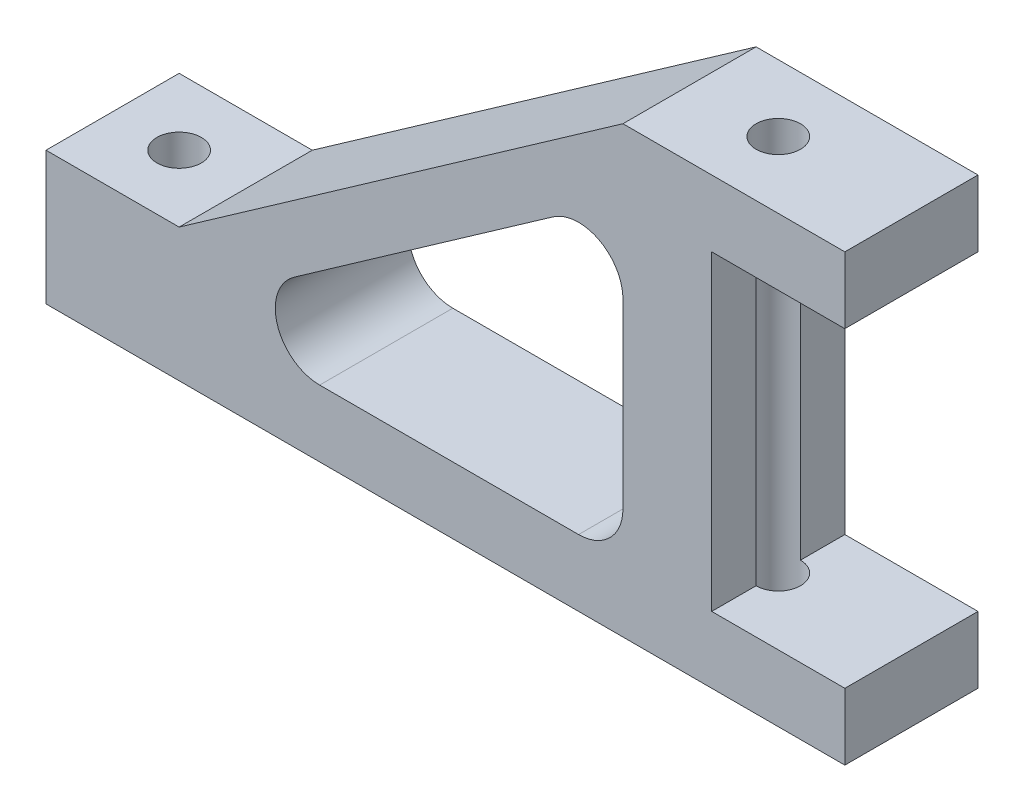
ISO-10303-21;
HEADER;
FILE_DESCRIPTION(('STEP AP214'),'2;1');
FILE_NAME('part.step','',(''),(''),'','','');
FILE_SCHEMA(('AUTOMOTIVE_DESIGN { 1 0 10303 214 1 1 1 1 }'));
ENDSEC;
DATA;
#1=APPLICATION_CONTEXT('core data for automotive mechanical design processes');
#2=APPLICATION_PROTOCOL_DEFINITION('international standard','automotive_design',2000,#1);
#3=PRODUCT_CONTEXT('',#1,'mechanical');
#4=PRODUCT('Part','Part','',(#3));
#5=PRODUCT_RELATED_PRODUCT_CATEGORY('part','',(#4));
#6=PRODUCT_DEFINITION_FORMATION('','',#4);
#7=PRODUCT_DEFINITION_CONTEXT('part definition',#1,'design');
#8=PRODUCT_DEFINITION('design','',#6,#7);
#9=PRODUCT_DEFINITION_SHAPE('','',#8);
#10=(LENGTH_UNIT() NAMED_UNIT(*) SI_UNIT(.MILLI.,.METRE.));
#11=(NAMED_UNIT(*) PLANE_ANGLE_UNIT() SI_UNIT($,.RADIAN.));
#12=(NAMED_UNIT(*) SI_UNIT($,.STERADIAN.) SOLID_ANGLE_UNIT());
#13=UNCERTAINTY_MEASURE_WITH_UNIT(LENGTH_MEASURE(1.E-05),#10,'distance_accuracy_value','');
#14=(GEOMETRIC_REPRESENTATION_CONTEXT(3) GLOBAL_UNCERTAINTY_ASSIGNED_CONTEXT((#13)) GLOBAL_UNIT_ASSIGNED_CONTEXT((#10,
#11,#12)) REPRESENTATION_CONTEXT('',''));
#15=CARTESIAN_POINT('',(0.,0.,0.));
#16=DIRECTION('',(0.,0.,1.));
#17=DIRECTION('',(1.,0.,0.));
#18=AXIS2_PLACEMENT_3D('',#15,#16,#17);
#19=CARTESIAN_POINT('',(72.4968152866244,0.,30.));
#20=DIRECTION('',(-1.,0.,0.));
#21=DIRECTION('',(0.,0.,1.));
#22=AXIS2_PLACEMENT_3D('',#19,#20,#21);
#23=PLANE('',#22);
#24=DIRECTION('',(0.,0.,-1.));
#25=VECTOR('',#24,1.);
#26=CARTESIAN_POINT('',(72.4968152866244,0.,30.));
#27=LINE('',#26,#25);
#28=CARTESIAN_POINT('',(72.4968152866244,0.,30.));
#29=VERTEX_POINT('',#28);
#30=CARTESIAN_POINT('',(72.4968152866244,0.,20.));
#31=VERTEX_POINT('',#30);
#32=EDGE_CURVE('E180',#29,#31,#27,.T.);
#33=ORIENTED_EDGE('',*,*,#32,.T.);
#34=DIRECTION('',(0.,1.,0.));
#35=VECTOR('',#34,1.);
#36=CARTESIAN_POINT('',(72.4968152866244,-75.,20.));
#37=LINE('',#36,#35);
#38=CARTESIAN_POINT('',(72.4968152866244,70.1656050955414,20.));
#39=VERTEX_POINT('',#38);
#40=EDGE_CURVE('E166',#31,#39,#37,.T.);
#41=ORIENTED_EDGE('',*,*,#40,.T.);
#42=DIRECTION('',(0.,0.,-1.));
#43=VECTOR('',#42,1.);
#44=CARTESIAN_POINT('',(72.4968152866244,70.1656050955414,30.));
#45=LINE('',#44,#43);
#46=CARTESIAN_POINT('',(72.4968152866244,70.1656050955414,30.));
#47=VERTEX_POINT('',#46);
#48=EDGE_CURVE('E177',#47,#39,#45,.T.);
#49=ORIENTED_EDGE('',*,*,#48,.F.);
#50=DIRECTION('',(0.,1.,0.));
#51=VECTOR('',#50,1.);
#52=CARTESIAN_POINT('',(72.4968152866244,0.,30.));
#53=LINE('',#52,#51);
#54=EDGE_CURVE('E278',#29,#47,#53,.T.);
#55=ORIENTED_EDGE('',*,*,#54,.F.);
#56=EDGE_LOOP('',(#33,#41,#49,#55));
#57=FACE_BOUND('',#56,.T.);
#58=ADVANCED_FACE('F38',(#57),#23,.F.);
#59=CARTESIAN_POINT('',(0.,0.,30.));
#60=DIRECTION('',(0.,0.,1.));
#61=DIRECTION('',(1.,0.,0.));
#62=AXIS2_PLACEMENT_3D('',#59,#60,#61);
#63=PLANE('',#62);
#64=DIRECTION('',(-1.,0.,0.));
#65=VECTOR('',#64,1.);
#66=CARTESIAN_POINT('',(-77.5031847133759,15.,30.));
#67=LINE('',#66,#65);
#68=CARTESIAN_POINT('',(-47.5031847133759,15.,30.));
#69=VERTEX_POINT('',#68);
#70=CARTESIAN_POINT('',(-77.5031847133759,15.,30.));
#71=VERTEX_POINT('',#70);
#72=EDGE_CURVE('E266',#69,#71,#67,.T.);
#73=ORIENTED_EDGE('',*,*,#72,.T.);
#74=DIRECTION('',(0.,-1.,0.));
#75=VECTOR('',#74,1.);
#76=CARTESIAN_POINT('',(-77.5031847133759,15.,30.));
#77=LINE('',#76,#75);
#78=CARTESIAN_POINT('',(-77.5031847133756,-15.,30.));
#79=VERTEX_POINT('',#78);
#80=EDGE_CURVE('E269',#71,#79,#77,.T.);
#81=ORIENTED_EDGE('',*,*,#80,.T.);
#82=DIRECTION('',(1.,0.,0.));
#83=VECTOR('',#82,1.);
#84=CARTESIAN_POINT('',(-77.5031847133756,-15.,30.));
#85=LINE('',#84,#83);
#86=CARTESIAN_POINT('',(102.496815286624,-15.,30.));
#87=VERTEX_POINT('',#86);
#88=EDGE_CURVE('E272',#79,#87,#85,.T.);
#89=ORIENTED_EDGE('',*,*,#88,.T.);
#90=DIRECTION('',(0.,1.,0.));
#91=VECTOR('',#90,1.);
#92=CARTESIAN_POINT('',(102.496815286624,-15.,30.));
#93=LINE('',#92,#91);
#94=CARTESIAN_POINT('',(102.496815286624,0.,30.));
#95=VERTEX_POINT('',#94);
#96=EDGE_CURVE('E274',#87,#95,#93,.T.);
#97=ORIENTED_EDGE('',*,*,#96,.T.);
#98=DIRECTION('',(-1.,0.,0.));
#99=VECTOR('',#98,1.);
#100=CARTESIAN_POINT('',(102.496815286624,0.,30.));
#101=LINE('',#100,#99);
#102=EDGE_CURVE('E276',#95,#29,#101,.T.);
#103=ORIENTED_EDGE('',*,*,#102,.T.);
#104=ORIENTED_EDGE('',*,*,#54,.T.);
#105=DIRECTION('',(1.,0.,0.));
#106=VECTOR('',#105,1.);
#107=CARTESIAN_POINT('',(72.4968152866244,70.1656050955414,30.));
#108=LINE('',#107,#106);
#109=CARTESIAN_POINT('',(102.496815286624,70.1656050955414,30.));
#110=VERTEX_POINT('',#109);
#111=EDGE_CURVE('E185',#47,#110,#108,.T.);
#112=ORIENTED_EDGE('',*,*,#111,.T.);
#113=DIRECTION('',(0.,1.,0.));
#114=VECTOR('',#113,1.);
#115=CARTESIAN_POINT('',(102.496815286624,70.1656050955414,30.));
#116=LINE('',#115,#114);
#117=CARTESIAN_POINT('',(102.496815286624,85.1656050955414,30.));
#118=VERTEX_POINT('',#117);
#119=EDGE_CURVE('E281',#110,#118,#116,.T.);
#120=ORIENTED_EDGE('',*,*,#119,.T.);
#121=DIRECTION('',(-1.,0.,0.));
#122=VECTOR('',#121,1.);
#123=CARTESIAN_POINT('',(102.496815286624,85.1656050955414,30.));
#124=LINE('',#123,#122);
#125=CARTESIAN_POINT('',(52.4968152866244,85.1656050955414,30.));
#126=VERTEX_POINT('',#125);
#127=EDGE_CURVE('E283',#118,#126,#124,.T.);
#128=ORIENTED_EDGE('',*,*,#127,.T.);
#129=DIRECTION('',(-0.818594540143988,-0.574371812371092,0.));
#130=VECTOR('',#129,1.);
#131=CARTESIAN_POINT('',(-47.5031847133759,15.,30.));
#132=LINE('',#131,#130);
#133=EDGE_CURVE('E285',#126,#69,#132,.T.);
#134=ORIENTED_EDGE('',*,*,#133,.T.);
#135=EDGE_LOOP('',(#73,#81,#89,#97,#103,#104,#112,#120,#128,#134));
#136=FACE_BOUND('',#135,.T.);
#137=DIRECTION('',(0.,1.,0.));
#138=VECTOR('',#137,1.);
#139=CARTESIAN_POINT('',(52.4968152866244,50.9329846080632,30.));
#140=LINE('',#139,#138);
#141=CARTESIAN_POINT('',(52.4968152866244,10.0000000000001,30.));
#142=VERTEX_POINT('',#141);
#143=CARTESIAN_POINT('',(52.4968152866244,50.9329846080632,30.));
#144=VERTEX_POINT('',#143);
#145=EDGE_CURVE('E225',#142,#144,#140,.T.);
#146=ORIENTED_EDGE('',*,*,#145,.F.);
#147=CARTESIAN_POINT('',(42.4968152866244,9.99999999999999,30.));
#148=DIRECTION('',(0.,0.,1.));
#149=DIRECTION('',(-1.,0.,0.));
#150=AXIS2_PLACEMENT_3D('',#147,#148,#149);
#151=CIRCLE('',#150,10.);
#152=CARTESIAN_POINT('',(42.4968152866243,0.,30.));
#153=VERTEX_POINT('',#152);
#154=EDGE_CURVE('E223',#153,#142,#151,.T.);
#155=ORIENTED_EDGE('',*,*,#154,.F.);
#156=DIRECTION('',(1.,0.,0.));
#157=VECTOR('',#156,1.);
#158=CARTESIAN_POINT('',(42.4968152866243,0.,30.));
#159=LINE('',#158,#157);
#160=CARTESIAN_POINT('',(-15.8408624863052,0.,30.));
#161=VERTEX_POINT('',#160);
#162=EDGE_CURVE('E234',#161,#153,#159,.T.);
#163=ORIENTED_EDGE('',*,*,#162,.F.);
#164=CARTESIAN_POINT('',(-15.8408624863056,10.,30.));
#165=DIRECTION('',(0.,0.,1.));
#166=DIRECTION('',(-1.,0.,0.));
#167=AXIS2_PLACEMENT_3D('',#164,#165,#166);
#168=CIRCLE('',#167,10.);
#169=CARTESIAN_POINT('',(-21.5845806100162,18.1859454014401,30.));
#170=VERTEX_POINT('',#169);
#171=EDGE_CURVE('E232',#170,#161,#168,.T.);
#172=ORIENTED_EDGE('',*,*,#171,.F.);
#173=DIRECTION('',(-0.818594540143988,-0.574371812371092,0.));
#174=VECTOR('',#173,1.);
#175=CARTESIAN_POINT('',(-21.5845806100162,18.1859454014401,30.));
#176=LINE('',#175,#174);
#177=CARTESIAN_POINT('',(36.7530971629133,59.1189300095032,30.));
#178=VERTEX_POINT('',#177);
#179=EDGE_CURVE('E230',#178,#170,#176,.T.);
#180=ORIENTED_EDGE('',*,*,#179,.F.);
#181=CARTESIAN_POINT('',(42.4968152866244,50.9329846080634,30.));
#182=DIRECTION('',(0.,0.,1.));
#183=DIRECTION('',(1.,0.,0.));
#184=AXIS2_PLACEMENT_3D('',#181,#182,#183);
#185=CIRCLE('',#184,10.);
#186=EDGE_CURVE('E228',#144,#178,#185,.T.);
#187=ORIENTED_EDGE('',*,*,#186,.F.);
#188=EDGE_LOOP('',(#146,#155,#163,#172,#180,#187));
#189=FACE_BOUND('',#188,.T.);
#190=ADVANCED_FACE('F337',(#136,#189),#63,.T.);
#191=CARTESIAN_POINT('',(0.,0.,0.));
#192=DIRECTION('',(0.,0.,1.));
#193=DIRECTION('',(1.,0.,0.));
#194=AXIS2_PLACEMENT_3D('',#191,#192,#193);
#195=PLANE('',#194);
#196=DIRECTION('',(-1.,0.,0.));
#197=VECTOR('',#196,1.);
#198=CARTESIAN_POINT('',(-77.5031847133759,15.,0.));
#199=LINE('',#198,#197);
#200=CARTESIAN_POINT('',(-47.5031847133759,15.,0.));
#201=VERTEX_POINT('',#200);
#202=CARTESIAN_POINT('',(-77.5031847133759,15.,0.));
#203=VERTEX_POINT('',#202);
#204=EDGE_CURVE('E265',#201,#203,#199,.T.);
#205=ORIENTED_EDGE('',*,*,#204,.F.);
#206=DIRECTION('',(-0.818594540143988,-0.574371812371092,0.));
#207=VECTOR('',#206,1.);
#208=CARTESIAN_POINT('',(-47.5031847133759,15.,0.));
#209=LINE('',#208,#207);
#210=CARTESIAN_POINT('',(52.4968152866244,85.1656050955414,0.));
#211=VERTEX_POINT('',#210);
#212=EDGE_CURVE('E270',#211,#201,#209,.T.);
#213=ORIENTED_EDGE('',*,*,#212,.F.);
#214=DIRECTION('',(-1.,0.,0.));
#215=VECTOR('',#214,1.);
#216=CARTESIAN_POINT('',(102.496815286624,85.1656050955414,0.));
#217=LINE('',#216,#215);
#218=CARTESIAN_POINT('',(102.496815286624,85.1656050955414,0.));
#219=VERTEX_POINT('',#218);
#220=EDGE_CURVE('E306',#219,#211,#217,.T.);
#221=ORIENTED_EDGE('',*,*,#220,.F.);
#222=DIRECTION('',(0.,1.,0.));
#223=VECTOR('',#222,1.);
#224=CARTESIAN_POINT('',(102.496815286624,70.1656050955414,0.));
#225=LINE('',#224,#223);
#226=CARTESIAN_POINT('',(102.496815286624,70.1656050955414,0.));
#227=VERTEX_POINT('',#226);
#228=EDGE_CURVE('E304',#227,#219,#225,.T.);
#229=ORIENTED_EDGE('',*,*,#228,.F.);
#230=DIRECTION('',(1.,0.,0.));
#231=VECTOR('',#230,1.);
#232=CARTESIAN_POINT('',(72.4968152866244,70.1656050955414,0.));
#233=LINE('',#232,#231);
#234=CARTESIAN_POINT('',(72.4968152866244,70.1656050955414,0.));
#235=VERTEX_POINT('',#234);
#236=EDGE_CURVE('E302',#235,#227,#233,.T.);
#237=ORIENTED_EDGE('',*,*,#236,.F.);
#238=DIRECTION('',(0.,1.,0.));
#239=VECTOR('',#238,1.);
#240=CARTESIAN_POINT('',(72.4968152866244,0.,0.));
#241=LINE('',#240,#239);
#242=CARTESIAN_POINT('',(72.4968152866244,0.,0.));
#243=VERTEX_POINT('',#242);
#244=EDGE_CURVE('E299',#243,#235,#241,.T.);
#245=ORIENTED_EDGE('',*,*,#244,.F.);
#246=DIRECTION('',(-1.,0.,0.));
#247=VECTOR('',#246,1.);
#248=CARTESIAN_POINT('',(102.496815286624,0.,0.));
#249=LINE('',#248,#247);
#250=CARTESIAN_POINT('',(102.496815286624,0.,0.));
#251=VERTEX_POINT('',#250);
#252=EDGE_CURVE('E296',#251,#243,#249,.T.);
#253=ORIENTED_EDGE('',*,*,#252,.F.);
#254=DIRECTION('',(0.,1.,0.));
#255=VECTOR('',#254,1.);
#256=CARTESIAN_POINT('',(102.496815286624,-15.,0.));
#257=LINE('',#256,#255);
#258=CARTESIAN_POINT('',(102.496815286624,-15.,0.));
#259=VERTEX_POINT('',#258);
#260=EDGE_CURVE('E294',#259,#251,#257,.T.);
#261=ORIENTED_EDGE('',*,*,#260,.F.);
#262=DIRECTION('',(1.,0.,0.));
#263=VECTOR('',#262,1.);
#264=CARTESIAN_POINT('',(-77.5031847133756,-15.,0.));
#265=LINE('',#264,#263);
#266=CARTESIAN_POINT('',(-77.5031847133756,-15.,0.));
#267=VERTEX_POINT('',#266);
#268=EDGE_CURVE('E292',#267,#259,#265,.T.);
#269=ORIENTED_EDGE('',*,*,#268,.F.);
#270=DIRECTION('',(0.,-1.,0.));
#271=VECTOR('',#270,1.);
#272=CARTESIAN_POINT('',(-77.5031847133759,15.,0.));
#273=LINE('',#272,#271);
#274=EDGE_CURVE('E290',#203,#267,#273,.T.);
#275=ORIENTED_EDGE('',*,*,#274,.F.);
#276=EDGE_LOOP('',(#205,#213,#221,#229,#237,#245,#253,#261,#269,#275));
#277=FACE_BOUND('',#276,.T.);
#278=CARTESIAN_POINT('',(42.4968152866244,9.99999999999999,0.));
#279=DIRECTION('',(0.,0.,1.));
#280=DIRECTION('',(-1.,0.,0.));
#281=AXIS2_PLACEMENT_3D('',#278,#279,#280);
#282=CIRCLE('',#281,10.);
#283=CARTESIAN_POINT('',(42.4968152866243,0.,0.));
#284=VERTEX_POINT('',#283);
#285=CARTESIAN_POINT('',(52.4968152866244,10.0000000000001,0.));
#286=VERTEX_POINT('',#285);
#287=EDGE_CURVE('E222',#284,#286,#282,.T.);
#288=ORIENTED_EDGE('',*,*,#287,.T.);
#289=DIRECTION('',(0.,1.,0.));
#290=VECTOR('',#289,1.);
#291=CARTESIAN_POINT('',(52.4968152866244,50.9329846080632,0.));
#292=LINE('',#291,#290);
#293=CARTESIAN_POINT('',(52.4968152866244,50.9329846080632,0.));
#294=VERTEX_POINT('',#293);
#295=EDGE_CURVE('E239',#286,#294,#292,.T.);
#296=ORIENTED_EDGE('',*,*,#295,.T.);
#297=CARTESIAN_POINT('',(42.4968152866244,50.9329846080634,0.));
#298=DIRECTION('',(0.,0.,1.));
#299=DIRECTION('',(1.,0.,0.));
#300=AXIS2_PLACEMENT_3D('',#297,#298,#299);
#301=CIRCLE('',#300,10.);
#302=CARTESIAN_POINT('',(36.7530971629133,59.1189300095032,0.));
#303=VERTEX_POINT('',#302);
#304=EDGE_CURVE('E242',#294,#303,#301,.T.);
#305=ORIENTED_EDGE('',*,*,#304,.T.);
#306=DIRECTION('',(-0.818594540143988,-0.574371812371092,0.));
#307=VECTOR('',#306,1.);
#308=CARTESIAN_POINT('',(-21.5845806100162,18.1859454014401,0.));
#309=LINE('',#308,#307);
#310=CARTESIAN_POINT('',(-21.5845806100162,18.1859454014401,0.));
#311=VERTEX_POINT('',#310);
#312=EDGE_CURVE('E245',#303,#311,#309,.T.);
#313=ORIENTED_EDGE('',*,*,#312,.T.);
#314=CARTESIAN_POINT('',(-15.8408624863056,10.,0.));
#315=DIRECTION('',(0.,0.,1.));
#316=DIRECTION('',(-1.,0.,0.));
#317=AXIS2_PLACEMENT_3D('',#314,#315,#316);
#318=CIRCLE('',#317,10.);
#319=CARTESIAN_POINT('',(-15.8408624863052,0.,0.));
#320=VERTEX_POINT('',#319);
#321=EDGE_CURVE('E248',#311,#320,#318,.T.);
#322=ORIENTED_EDGE('',*,*,#321,.T.);
#323=DIRECTION('',(1.,0.,0.));
#324=VECTOR('',#323,1.);
#325=CARTESIAN_POINT('',(42.4968152866243,0.,0.));
#326=LINE('',#325,#324);
#327=EDGE_CURVE('E226',#320,#284,#326,.T.);
#328=ORIENTED_EDGE('',*,*,#327,.T.);
#329=EDGE_LOOP('',(#288,#296,#305,#313,#322,#328));
#330=FACE_BOUND('',#329,.T.);
#331=ADVANCED_FACE('F326',(#277,#330),#195,.F.);
#332=CARTESIAN_POINT('',(-77.5031847133759,15.,30.));
#333=DIRECTION('',(0.,-1.,0.));
#334=DIRECTION('',(0.,0.,-1.));
#335=AXIS2_PLACEMENT_3D('',#332,#333,#334);
#336=PLANE('',#335);
#337=CARTESIAN_POINT('',(-62.5031847133759,15.,15.));
#338=DIRECTION('',(0.,-1.,0.));
#339=DIRECTION('',(0.,0.,-1.));
#340=AXIS2_PLACEMENT_3D('',#337,#338,#339);
#341=CIRCLE('',#340,5.);
#342=CARTESIAN_POINT('',(-62.5031847133759,15.,10.));
#343=VERTEX_POINT('',#342);
#344=EDGE_CURVE('E217',#343,#343,#341,.T.);
#345=ORIENTED_EDGE('',*,*,#344,.T.);
#346=EDGE_LOOP('',(#345));
#347=FACE_BOUND('',#346,.T.);
#348=ORIENTED_EDGE('',*,*,#204,.T.);
#349=DIRECTION('',(0.,0.,-1.));
#350=VECTOR('',#349,1.);
#351=CARTESIAN_POINT('',(-77.5031847133759,15.,30.));
#352=LINE('',#351,#350);
#353=EDGE_CURVE('E11',#71,#203,#352,.T.);
#354=ORIENTED_EDGE('',*,*,#353,.F.);
#355=ORIENTED_EDGE('',*,*,#72,.F.);
#356=DIRECTION('',(0.,0.,-1.));
#357=VECTOR('',#356,1.);
#358=CARTESIAN_POINT('',(-47.5031847133759,15.,30.));
#359=LINE('',#358,#357);
#360=EDGE_CURVE('E287',#69,#201,#359,.T.);
#361=ORIENTED_EDGE('',*,*,#360,.T.);
#362=EDGE_LOOP('',(#348,#354,#355,#361));
#363=FACE_BOUND('',#362,.T.);
#364=ADVANCED_FACE('F40',(#347,#363),#336,.F.);
#365=CARTESIAN_POINT('',(-77.5031847133759,15.,30.));
#366=DIRECTION('',(1.,0.,0.));
#367=DIRECTION('',(0.,1.,0.));
#368=AXIS2_PLACEMENT_3D('',#365,#366,#367);
#369=PLANE('',#368);
#370=ORIENTED_EDGE('',*,*,#274,.T.);
#371=DIRECTION('',(0.,0.,-1.));
#372=VECTOR('',#371,1.);
#373=CARTESIAN_POINT('',(-77.5031847133756,-15.,30.));
#374=LINE('',#373,#372);
#375=EDGE_CURVE('E47',#79,#267,#374,.T.);
#376=ORIENTED_EDGE('',*,*,#375,.F.);
#377=ORIENTED_EDGE('',*,*,#80,.F.);
#378=ORIENTED_EDGE('',*,*,#353,.T.);
#379=EDGE_LOOP('',(#370,#376,#377,#378));
#380=FACE_BOUND('',#379,.T.);
#381=ADVANCED_FACE('F360',(#380),#369,.F.);
#382=CARTESIAN_POINT('',(-77.5031847133756,-15.,30.));
#383=DIRECTION('',(0.,1.,0.));
#384=DIRECTION('',(0.,0.,1.));
#385=AXIS2_PLACEMENT_3D('',#382,#383,#384);
#386=PLANE('',#385);
#387=CARTESIAN_POINT('',(-62.5031847133759,-15.,15.));
#388=DIRECTION('',(0.,1.,0.));
#389=DIRECTION('',(0.,0.,1.));
#390=AXIS2_PLACEMENT_3D('',#387,#388,#389);
#391=CIRCLE('',#390,5.);
#392=CARTESIAN_POINT('',(-62.5031847133759,-15.,20.));
#393=VERTEX_POINT('',#392);
#394=EDGE_CURVE('E42',#393,#393,#391,.T.);
#395=ORIENTED_EDGE('',*,*,#394,.T.);
#396=EDGE_LOOP('',(#395));
#397=FACE_BOUND('',#396,.T.);
#398=CARTESIAN_POINT('',(72.4968152866241,-15.,15.));
#399=DIRECTION('',(0.,1.,0.));
#400=DIRECTION('',(0.,0.,1.));
#401=AXIS2_PLACEMENT_3D('',#398,#399,#400);
#402=CIRCLE('',#401,5.);
#403=CARTESIAN_POINT('',(72.4968152866241,-15.,20.));
#404=VERTEX_POINT('',#403);
#405=EDGE_CURVE('E213',#404,#404,#402,.T.);
#406=ORIENTED_EDGE('',*,*,#405,.T.);
#407=EDGE_LOOP('',(#406));
#408=FACE_BOUND('',#407,.T.);
#409=ORIENTED_EDGE('',*,*,#268,.T.);
#410=DIRECTION('',(0.,0.,-1.));
#411=VECTOR('',#410,1.);
#412=CARTESIAN_POINT('',(102.496815286624,-15.,30.));
#413=LINE('',#412,#411);
#414=EDGE_CURVE('E197',#87,#259,#413,.T.);
#415=ORIENTED_EDGE('',*,*,#414,.F.);
#416=ORIENTED_EDGE('',*,*,#88,.F.);
#417=ORIENTED_EDGE('',*,*,#375,.T.);
#418=EDGE_LOOP('',(#409,#415,#416,#417));
#419=FACE_BOUND('',#418,.T.);
#420=ADVANCED_FACE('F357',(#397,#408,#419),#386,.F.);
#421=CARTESIAN_POINT('',(102.496815286624,-15.,30.));
#422=DIRECTION('',(-1.,0.,0.));
#423=DIRECTION('',(0.,-1.,0.));
#424=AXIS2_PLACEMENT_3D('',#421,#422,#423);
#425=PLANE('',#424);
#426=ORIENTED_EDGE('',*,*,#260,.T.);
#427=DIRECTION('',(0.,0.,-1.));
#428=VECTOR('',#427,1.);
#429=CARTESIAN_POINT('',(102.496815286624,0.,30.));
#430=LINE('',#429,#428);
#431=EDGE_CURVE('E194',#95,#251,#430,.T.);
#432=ORIENTED_EDGE('',*,*,#431,.F.);
#433=ORIENTED_EDGE('',*,*,#96,.F.);
#434=ORIENTED_EDGE('',*,*,#414,.T.);
#435=EDGE_LOOP('',(#426,#432,#433,#434));
#436=FACE_BOUND('',#435,.T.);
#437=ADVANCED_FACE('F353',(#436),#425,.F.);
#438=CARTESIAN_POINT('',(102.496815286624,0.,30.));
#439=DIRECTION('',(0.,-1.,0.));
#440=DIRECTION('',(1.,0.,0.));
#441=AXIS2_PLACEMENT_3D('',#438,#439,#440);
#442=PLANE('',#441);
#443=CARTESIAN_POINT('',(72.4968152866244,0.,9.99999999999999));
#444=VERTEX_POINT('',#443);
#445=EDGE_CURVE('E186',#444,#243,#27,.T.);
#446=ORIENTED_EDGE('',*,*,#445,.F.);
#447=CARTESIAN_POINT('',(72.4968152866241,0.,15.));
#448=DIRECTION('',(0.,-1.,0.));
#449=DIRECTION('',(1.,0.,0.));
#450=AXIS2_PLACEMENT_3D('',#447,#448,#449);
#451=CIRCLE('',#450,5.);
#452=EDGE_CURVE('E181',#444,#31,#451,.T.);
#453=ORIENTED_EDGE('',*,*,#452,.T.);
#454=ORIENTED_EDGE('',*,*,#32,.F.);
#455=ORIENTED_EDGE('',*,*,#102,.F.);
#456=ORIENTED_EDGE('',*,*,#431,.T.);
#457=ORIENTED_EDGE('',*,*,#252,.T.);
#458=EDGE_LOOP('',(#446,#453,#454,#455,#456,#457));
#459=FACE_BOUND('',#458,.T.);
#460=ADVANCED_FACE('F345',(#459),#442,.F.);
#461=CARTESIAN_POINT('',(72.4968152866244,70.1656050955414,9.99999999999999));
#462=VERTEX_POINT('',#461);
#463=EDGE_CURVE('E187',#462,#235,#45,.T.);
#464=ORIENTED_EDGE('',*,*,#463,.F.);
#465=DIRECTION('',(0.,1.,0.));
#466=VECTOR('',#465,1.);
#467=CARTESIAN_POINT('',(72.4968152866244,-75.,9.99999999999999));
#468=LINE('',#467,#466);
#469=EDGE_CURVE('E55',#462,#444,#468,.F.);
#470=ORIENTED_EDGE('',*,*,#469,.T.);
#471=ORIENTED_EDGE('',*,*,#445,.T.);
#472=ORIENTED_EDGE('',*,*,#244,.T.);
#473=EDGE_LOOP('',(#464,#470,#471,#472));
#474=FACE_BOUND('',#473,.T.);
#475=ADVANCED_FACE('F347',(#474),#23,.F.);
#476=CARTESIAN_POINT('',(72.4968152866244,70.1656050955414,30.));
#477=DIRECTION('',(0.,1.,0.));
#478=DIRECTION('',(0.,0.,1.));
#479=AXIS2_PLACEMENT_3D('',#476,#477,#478);
#480=PLANE('',#479);
#481=ORIENTED_EDGE('',*,*,#48,.T.);
#482=CARTESIAN_POINT('',(72.4968152866241,70.1656050955414,15.));
#483=DIRECTION('',(0.,1.,0.));
#484=DIRECTION('',(0.,0.,1.));
#485=AXIS2_PLACEMENT_3D('',#482,#483,#484);
#486=CIRCLE('',#485,5.);
#487=EDGE_CURVE('E162',#39,#462,#486,.T.);
#488=ORIENTED_EDGE('',*,*,#487,.T.);
#489=ORIENTED_EDGE('',*,*,#463,.T.);
#490=ORIENTED_EDGE('',*,*,#236,.T.);
#491=DIRECTION('',(0.,0.,-1.));
#492=VECTOR('',#491,1.);
#493=CARTESIAN_POINT('',(102.496815286624,70.1656050955414,30.));
#494=LINE('',#493,#492);
#495=EDGE_CURVE('E190',#110,#227,#494,.T.);
#496=ORIENTED_EDGE('',*,*,#495,.F.);
#497=ORIENTED_EDGE('',*,*,#111,.F.);
#498=EDGE_LOOP('',(#481,#488,#489,#490,#496,#497));
#499=FACE_BOUND('',#498,.T.);
#500=ADVANCED_FACE('F183',(#499),#480,.F.);
#501=CARTESIAN_POINT('',(102.496815286624,70.1656050955414,30.));
#502=DIRECTION('',(-1.,0.,0.));
#503=DIRECTION('',(0.,-1.,0.));
#504=AXIS2_PLACEMENT_3D('',#501,#502,#503);
#505=PLANE('',#504);
#506=ORIENTED_EDGE('',*,*,#228,.T.);
#507=DIRECTION('',(0.,0.,-1.));
#508=VECTOR('',#507,1.);
#509=CARTESIAN_POINT('',(102.496815286624,85.1656050955414,30.));
#510=LINE('',#509,#508);
#511=EDGE_CURVE('E313',#118,#219,#510,.T.);
#512=ORIENTED_EDGE('',*,*,#511,.F.);
#513=ORIENTED_EDGE('',*,*,#119,.F.);
#514=ORIENTED_EDGE('',*,*,#495,.T.);
#515=EDGE_LOOP('',(#506,#512,#513,#514));
#516=FACE_BOUND('',#515,.T.);
#517=ADVANCED_FACE('F322',(#516),#505,.F.);
#518=CARTESIAN_POINT('',(102.496815286624,85.1656050955414,30.));
#519=DIRECTION('',(0.,-1.,0.));
#520=DIRECTION('',(0.,0.,-1.));
#521=AXIS2_PLACEMENT_3D('',#518,#519,#520);
#522=PLANE('',#521);
#523=CARTESIAN_POINT('',(72.4968152866241,85.1656050955414,15.));
#524=DIRECTION('',(0.,-1.,0.));
#525=DIRECTION('',(0.,0.,-1.));
#526=AXIS2_PLACEMENT_3D('',#523,#524,#525);
#527=CIRCLE('',#526,5.);
#528=CARTESIAN_POINT('',(72.4968152866241,85.1656050955414,9.99999999999999));
#529=VERTEX_POINT('',#528);
#530=EDGE_CURVE('E171',#529,#529,#527,.T.);
#531=ORIENTED_EDGE('',*,*,#530,.T.);
#532=EDGE_LOOP('',(#531));
#533=FACE_BOUND('',#532,.T.);
#534=ORIENTED_EDGE('',*,*,#220,.T.);
#535=DIRECTION('',(0.,0.,-1.));
#536=VECTOR('',#535,1.);
#537=CARTESIAN_POINT('',(52.4968152866244,85.1656050955414,30.));
#538=LINE('',#537,#536);
#539=EDGE_CURVE('E311',#126,#211,#538,.T.);
#540=ORIENTED_EDGE('',*,*,#539,.F.);
#541=ORIENTED_EDGE('',*,*,#127,.F.);
#542=ORIENTED_EDGE('',*,*,#511,.T.);
#543=EDGE_LOOP('',(#534,#540,#541,#542));
#544=FACE_BOUND('',#543,.T.);
#545=ADVANCED_FACE('F204',(#533,#544),#522,.F.);
#546=CARTESIAN_POINT('',(-47.5031847133759,15.,30.));
#547=DIRECTION('',(0.574371812371092,-0.818594540143988,0.));
#548=DIRECTION('',(0.818594540143988,0.574371812371092,0.));
#549=AXIS2_PLACEMENT_3D('',#546,#547,#548);
#550=PLANE('',#549);
#551=ORIENTED_EDGE('',*,*,#212,.T.);
#552=ORIENTED_EDGE('',*,*,#360,.F.);
#553=ORIENTED_EDGE('',*,*,#133,.F.);
#554=ORIENTED_EDGE('',*,*,#539,.T.);
#555=EDGE_LOOP('',(#551,#552,#553,#554));
#556=FACE_BOUND('',#555,.T.);
#557=ADVANCED_FACE('F333',(#556),#550,.F.);
#558=CARTESIAN_POINT('',(42.4968152866244,9.99999999999999,30.));
#559=DIRECTION('',(0.,0.,-1.));
#560=DIRECTION('',(-1.,0.,0.));
#561=AXIS2_PLACEMENT_3D('',#558,#559,#560);
#562=CYLINDRICAL_SURFACE('',#561,10.);
#563=ORIENTED_EDGE('',*,*,#287,.F.);
#564=DIRECTION('',(0.,0.,-1.));
#565=VECTOR('',#564,1.);
#566=CARTESIAN_POINT('',(42.4968152866243,0.,30.));
#567=LINE('',#566,#565);
#568=EDGE_CURVE('E236',#153,#284,#567,.T.);
#569=ORIENTED_EDGE('',*,*,#568,.F.);
#570=ORIENTED_EDGE('',*,*,#154,.T.);
#571=DIRECTION('',(0.,0.,-1.));
#572=VECTOR('',#571,1.);
#573=CARTESIAN_POINT('',(52.4968152866244,10.0000000000001,30.));
#574=LINE('',#573,#572);
#575=EDGE_CURVE('E262',#142,#286,#574,.T.);
#576=ORIENTED_EDGE('',*,*,#575,.T.);
#577=EDGE_LOOP('',(#563,#569,#570,#576));
#578=FACE_BOUND('',#577,.T.);
#579=ADVANCED_FACE('F417',(#578),#562,.F.);
#580=CARTESIAN_POINT('',(52.4968152866244,50.9329846080632,30.));
#581=DIRECTION('',(-1.,0.,0.));
#582=DIRECTION('',(0.,0.,1.));
#583=AXIS2_PLACEMENT_3D('',#580,#581,#582);
#584=PLANE('',#583);
#585=ORIENTED_EDGE('',*,*,#295,.F.);
#586=ORIENTED_EDGE('',*,*,#575,.F.);
#587=ORIENTED_EDGE('',*,*,#145,.T.);
#588=DIRECTION('',(0.,0.,-1.));
#589=VECTOR('',#588,1.);
#590=CARTESIAN_POINT('',(52.4968152866244,50.9329846080632,30.));
#591=LINE('',#590,#589);
#592=EDGE_CURVE('E260',#144,#294,#591,.T.);
#593=ORIENTED_EDGE('',*,*,#592,.T.);
#594=EDGE_LOOP('',(#585,#586,#587,#593));
#595=FACE_BOUND('',#594,.T.);
#596=ADVANCED_FACE('F413',(#595),#584,.T.);
#597=CARTESIAN_POINT('',(42.4968152866244,50.9329846080634,30.));
#598=DIRECTION('',(0.,0.,-1.));
#599=DIRECTION('',(-1.,0.,0.));
#600=AXIS2_PLACEMENT_3D('',#597,#598,#599);
#601=CYLINDRICAL_SURFACE('',#600,10.);
#602=ORIENTED_EDGE('',*,*,#304,.F.);
#603=ORIENTED_EDGE('',*,*,#592,.F.);
#604=ORIENTED_EDGE('',*,*,#186,.T.);
#605=DIRECTION('',(0.,0.,-1.));
#606=VECTOR('',#605,1.);
#607=CARTESIAN_POINT('',(36.7530971629133,59.1189300095032,30.));
#608=LINE('',#607,#606);
#609=EDGE_CURVE('E258',#178,#303,#608,.T.);
#610=ORIENTED_EDGE('',*,*,#609,.T.);
#611=EDGE_LOOP('',(#602,#603,#604,#610));
#612=FACE_BOUND('',#611,.T.);
#613=ADVANCED_FACE('F409',(#612),#601,.F.);
#614=CARTESIAN_POINT('',(-21.5845806100162,18.1859454014401,30.));
#615=DIRECTION('',(0.574371812371092,-0.818594540143988,0.));
#616=DIRECTION('',(0.818594540143988,0.574371812371092,0.));
#617=AXIS2_PLACEMENT_3D('',#614,#615,#616);
#618=PLANE('',#617);
#619=ORIENTED_EDGE('',*,*,#312,.F.);
#620=ORIENTED_EDGE('',*,*,#609,.F.);
#621=ORIENTED_EDGE('',*,*,#179,.T.);
#622=DIRECTION('',(0.,0.,-1.));
#623=VECTOR('',#622,1.);
#624=CARTESIAN_POINT('',(-21.5845806100162,18.1859454014401,30.));
#625=LINE('',#624,#623);
#626=EDGE_CURVE('E256',#170,#311,#625,.T.);
#627=ORIENTED_EDGE('',*,*,#626,.T.);
#628=EDGE_LOOP('',(#619,#620,#621,#627));
#629=FACE_BOUND('',#628,.T.);
#630=ADVANCED_FACE('F405',(#629),#618,.T.);
#631=CARTESIAN_POINT('',(-15.8408624863056,10.,30.));
#632=DIRECTION('',(0.,0.,-1.));
#633=DIRECTION('',(-1.,0.,0.));
#634=AXIS2_PLACEMENT_3D('',#631,#632,#633);
#635=CYLINDRICAL_SURFACE('',#634,10.);
#636=ORIENTED_EDGE('',*,*,#321,.F.);
#637=ORIENTED_EDGE('',*,*,#626,.F.);
#638=ORIENTED_EDGE('',*,*,#171,.T.);
#639=DIRECTION('',(0.,0.,-1.));
#640=VECTOR('',#639,1.);
#641=CARTESIAN_POINT('',(-15.8408624863052,0.,30.));
#642=LINE('',#641,#640);
#643=EDGE_CURVE('E63',#161,#320,#642,.T.);
#644=ORIENTED_EDGE('',*,*,#643,.T.);
#645=EDGE_LOOP('',(#636,#637,#638,#644));
#646=FACE_BOUND('',#645,.T.);
#647=ADVANCED_FACE('F402',(#646),#635,.F.);
#648=CARTESIAN_POINT('',(42.4968152866243,0.,30.));
#649=DIRECTION('',(0.,1.,0.));
#650=DIRECTION('',(-1.,0.,0.));
#651=AXIS2_PLACEMENT_3D('',#648,#649,#650);
#652=PLANE('',#651);
#653=ORIENTED_EDGE('',*,*,#327,.F.);
#654=ORIENTED_EDGE('',*,*,#643,.F.);
#655=ORIENTED_EDGE('',*,*,#162,.T.);
#656=ORIENTED_EDGE('',*,*,#568,.T.);
#657=EDGE_LOOP('',(#653,#654,#655,#656));
#658=FACE_BOUND('',#657,.T.);
#659=ADVANCED_FACE('F209',(#658),#652,.T.);
#660=CARTESIAN_POINT('',(72.4968152866241,-75.,15.));
#661=DIRECTION('',(0.,1.,0.));
#662=DIRECTION('',(0.,0.,1.));
#663=AXIS2_PLACEMENT_3D('',#660,#661,#662);
#664=CYLINDRICAL_SURFACE('',#663,5.);
#665=ORIENTED_EDGE('',*,*,#469,.F.);
#666=ORIENTED_EDGE('',*,*,#487,.F.);
#667=ORIENTED_EDGE('',*,*,#40,.F.);
#668=ORIENTED_EDGE('',*,*,#452,.F.);
#669=EDGE_LOOP('',(#665,#666,#667,#668));
#670=FACE_BOUND('',#669,.T.);
#671=ORIENTED_EDGE('',*,*,#530,.F.);
#672=EDGE_LOOP('',(#671));
#673=FACE_BOUND('',#672,.T.);
#674=ORIENTED_EDGE('',*,*,#405,.F.);
#675=EDGE_LOOP('',(#674));
#676=FACE_BOUND('',#675,.T.);
#677=ADVANCED_FACE('F164',(#670,#673,#676),#664,.F.);
#678=CARTESIAN_POINT('',(-62.5031847133759,-75.,15.));
#679=DIRECTION('',(0.,1.,0.));
#680=DIRECTION('',(0.,0.,1.));
#681=AXIS2_PLACEMENT_3D('',#678,#679,#680);
#682=CYLINDRICAL_SURFACE('',#681,5.);
#683=ORIENTED_EDGE('',*,*,#394,.F.);
#684=EDGE_LOOP('',(#683));
#685=FACE_BOUND('',#684,.T.);
#686=ORIENTED_EDGE('',*,*,#344,.F.);
#687=EDGE_LOOP('',(#686));
#688=FACE_BOUND('',#687,.T.);
#689=ADVANCED_FACE('F208',(#685,#688),#682,.F.);
#690=CLOSED_SHELL('',(#58,#190,#331,#364,#381,#420,#437,#460,#475,#500,#517,#545,#557,#579,#596,
#613,#630,#647,#659,#677,#689));
#691=MANIFOLD_SOLID_BREP('B2',#690);
#692=ADVANCED_BREP_SHAPE_REPRESENTATION('',(#18,#691),#14);
#693=SHAPE_DEFINITION_REPRESENTATION(#9,#692);
ENDSEC;
END-ISO-10303-21;
